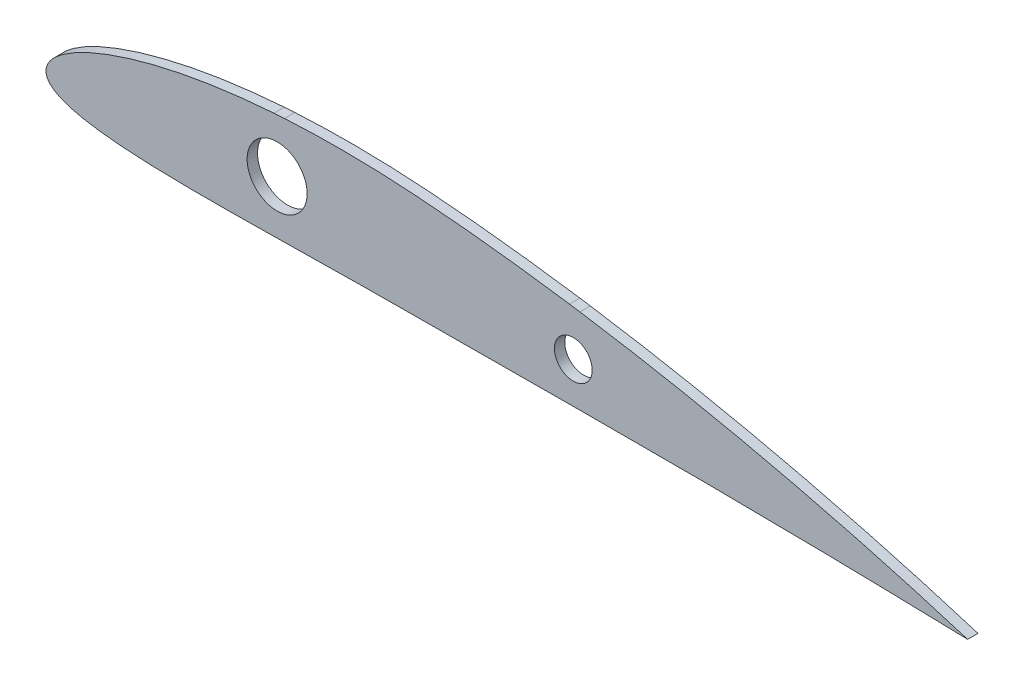
ISO-10303-21;
HEADER;
FILE_DESCRIPTION(('STEP AP214'),'2;1');
FILE_NAME('part.step','',(''),(''),'','','');
FILE_SCHEMA(('AUTOMOTIVE_DESIGN { 1 0 10303 214 1 1 1 1 }'));
ENDSEC;
DATA;
#1=APPLICATION_CONTEXT('core data for automotive mechanical design processes');
#2=APPLICATION_PROTOCOL_DEFINITION('international standard','automotive_design',2000,#1);
#3=PRODUCT_CONTEXT('',#1,'mechanical');
#4=PRODUCT('Part','Part','',(#3));
#5=PRODUCT_RELATED_PRODUCT_CATEGORY('part','',(#4));
#6=PRODUCT_DEFINITION_FORMATION('','',#4);
#7=PRODUCT_DEFINITION_CONTEXT('part definition',#1,'design');
#8=PRODUCT_DEFINITION('design','',#6,#7);
#9=PRODUCT_DEFINITION_SHAPE('','',#8);
#10=(LENGTH_UNIT() NAMED_UNIT(*) SI_UNIT(.MILLI.,.METRE.));
#11=(NAMED_UNIT(*) PLANE_ANGLE_UNIT() SI_UNIT($,.RADIAN.));
#12=(NAMED_UNIT(*) SI_UNIT($,.STERADIAN.) SOLID_ANGLE_UNIT());
#13=UNCERTAINTY_MEASURE_WITH_UNIT(LENGTH_MEASURE(1.E-05),#10,'distance_accuracy_value','');
#14=(GEOMETRIC_REPRESENTATION_CONTEXT(3) GLOBAL_UNCERTAINTY_ASSIGNED_CONTEXT((#13)) GLOBAL_UNIT_ASSIGNED_CONTEXT((#10,
#11,#12)) REPRESENTATION_CONTEXT('',''));
#15=CARTESIAN_POINT('',(0.,0.,0.));
#16=DIRECTION('',(0.,0.,1.));
#17=DIRECTION('',(1.,0.,0.));
#18=AXIS2_PLACEMENT_3D('',#15,#16,#17);
#19=CARTESIAN_POINT('',(149.894619256414,106.854755989877,1.4));
#20=CARTESIAN_POINT('',(158.680275082572,106.889957074756,1.4));
#21=CARTESIAN_POINT('',(176.251614136073,106.916321204518,1.4));
#22=CARTESIAN_POINT('',(202.609661936218,106.73064533298,1.4));
#23=CARTESIAN_POINT('',(228.96468105988,106.292568252224,1.4));
#24=CARTESIAN_POINT('',(246.530526636941,105.850587700062,1.4));
#25=CARTESIAN_POINT('',(255.312881654357,105.60676111473,1.4));
#26=B_SPLINE_CURVE_WITH_KNOTS('',3,(#19,#20,#21,#22,#23,#24,#25),.UNSPECIFIED.,.F.,.F.,(4,1,1,1,
4),(0.581490104405728,0.685469054372265,0.789448004338803,0.89342695430534,0.997405904271877),.UNSPECIFIED.);
#27=DIRECTION('',(0.,0.,-1.));
#28=VECTOR('',#27,1.);
#29=SURFACE_OF_LINEAR_EXTRUSION('',#26,#28);
#30=CARTESIAN_POINT('',(149.894619256414,106.854755989877,-1.4));
#31=CARTESIAN_POINT('',(158.680275082572,106.889957074756,-1.4));
#32=CARTESIAN_POINT('',(176.251614136073,106.916321204518,-1.4));
#33=CARTESIAN_POINT('',(202.609661936218,106.73064533298,-1.4));
#34=CARTESIAN_POINT('',(228.96468105988,106.292568252224,-1.4));
#35=CARTESIAN_POINT('',(246.530526636941,105.850587700062,-1.4));
#36=CARTESIAN_POINT('',(255.312881654357,105.60676111473,-1.4));
#37=B_SPLINE_CURVE_WITH_KNOTS('',3,(#30,#31,#32,#33,#34,#35,#36),.UNSPECIFIED.,.F.,.F.,(4,1,1,1,
4),(0.581490104405728,0.685469054372265,0.789448004338803,0.89342695430534,0.997405904271877),.UNSPECIFIED.);
#38=CARTESIAN_POINT('',(149.894619256414,106.854755989877,-1.4));
#39=VERTEX_POINT('',#38);
#40=CARTESIAN_POINT('',(255.312881654357,105.60676111473,-1.4));
#41=VERTEX_POINT('',#40);
#42=EDGE_CURVE('E264',#39,#41,#37,.T.);
#43=ORIENTED_EDGE('',*,*,#42,.T.);
#44=DIRECTION('',(0.,0.,-1.));
#45=VECTOR('',#44,1.);
#46=CARTESIAN_POINT('',(255.312881654357,105.60676111473,1.4));
#47=LINE('',#46,#45);
#48=CARTESIAN_POINT('',(255.312881654357,105.60676111473,1.4));
#49=VERTEX_POINT('',#48);
#50=EDGE_CURVE('E11',#49,#41,#47,.T.);
#51=ORIENTED_EDGE('',*,*,#50,.F.);
#52=CARTESIAN_POINT('',(149.894619256414,106.854755989877,1.4));
#53=VERTEX_POINT('',#52);
#54=EDGE_CURVE('E211',#53,#49,#26,.T.);
#55=ORIENTED_EDGE('',*,*,#54,.F.);
#56=DIRECTION('',(0.,0.,-1.));
#57=VECTOR('',#56,1.);
#58=CARTESIAN_POINT('',(149.894619256414,106.854755989877,1.4));
#59=LINE('',#58,#57);
#60=EDGE_CURVE('E142',#53,#39,#59,.T.);
#61=ORIENTED_EDGE('',*,*,#60,.T.);
#62=EDGE_LOOP('',(#43,#51,#55,#61));
#63=FACE_BOUND('',#62,.T.);
#64=ADVANCED_FACE('F37',(#63),#29,.F.);
#65=CARTESIAN_POINT('',(255.312881654358,105.60676111473,1.4));
#66=CARTESIAN_POINT('',(246.756257413018,108.260896884077,1.4));
#67=CARTESIAN_POINT('',(229.54444233678,113.256971155102,1.4));
#68=CARTESIAN_POINT('',(203.47024089322,119.799788090143,1.4));
#69=CARTESIAN_POINT('',(177.178570900204,125.40441699623,1.4));
#70=CARTESIAN_POINT('',(159.522198848407,128.478032217996,1.4));
#71=CARTESIAN_POINT('',(150.666396797955,129.829620390137,1.4));
#72=B_SPLINE_CURVE_WITH_KNOTS('',3,(#65,#66,#67,#68,#69,#70,#71),.UNSPECIFIED.,.F.,.F.,(4,1,1,1,
4),(0.00222757964376328,0.106325046268382,0.210422512893002,0.314519979517621,0.41861744614224),.UNSPECIFIED.);
#73=DIRECTION('',(0.,0.,-1.));
#74=VECTOR('',#73,1.);
#75=SURFACE_OF_LINEAR_EXTRUSION('',#72,#74);
#76=CARTESIAN_POINT('',(255.312881654358,105.60676111473,-1.4));
#77=CARTESIAN_POINT('',(246.756257413018,108.260896884077,-1.4));
#78=CARTESIAN_POINT('',(229.54444233678,113.256971155102,-1.4));
#79=CARTESIAN_POINT('',(203.47024089322,119.799788090143,-1.4));
#80=CARTESIAN_POINT('',(177.178570900204,125.40441699623,-1.4));
#81=CARTESIAN_POINT('',(159.522198848407,128.478032217996,-1.4));
#82=CARTESIAN_POINT('',(150.666396797955,129.829620390137,-1.4));
#83=B_SPLINE_CURVE_WITH_KNOTS('',3,(#76,#77,#78,#79,#80,#81,#82),.UNSPECIFIED.,.F.,.F.,(4,1,1,1,
4),(0.00222757964376328,0.106325046268382,0.210422512893002,0.314519979517621,0.41861744614224),.UNSPECIFIED.);
#84=CARTESIAN_POINT('',(150.666396797955,129.829620390137,-1.4));
#85=VERTEX_POINT('',#84);
#86=EDGE_CURVE('E258',#41,#85,#83,.T.);
#87=ORIENTED_EDGE('',*,*,#86,.T.);
#88=DIRECTION('',(0.,0.,-1.));
#89=VECTOR('',#88,1.);
#90=CARTESIAN_POINT('',(150.666396797955,129.829620390137,1.4));
#91=LINE('',#90,#89);
#92=CARTESIAN_POINT('',(150.666396797955,129.829620390137,1.4));
#93=VERTEX_POINT('',#92);
#94=EDGE_CURVE('E46',#93,#85,#91,.T.);
#95=ORIENTED_EDGE('',*,*,#94,.F.);
#96=EDGE_CURVE('E103',#49,#93,#72,.T.);
#97=ORIENTED_EDGE('',*,*,#96,.F.);
#98=ORIENTED_EDGE('',*,*,#50,.T.);
#99=EDGE_LOOP('',(#87,#95,#97,#98));
#100=FACE_BOUND('',#99,.T.);
#101=ADVANCED_FACE('F203',(#100),#75,.F.);
#102=CARTESIAN_POINT('',(22.4132301607229,149.108042258837,1.4));
#103=DIRECTION('',(-0.14864544722991,-0.988890555631825,0.));
#104=DIRECTION('',(0.988890555631825,-0.14864544722991,0.));
#105=AXIS2_PLACEMENT_3D('',#102,#103,#104);
#106=PLANE('',#105);
#107=DIRECTION('',(-0.988890555631825,0.14864544722991,0.));
#108=VECTOR('',#107,1.);
#109=CARTESIAN_POINT('',(22.4132301607229,149.108042258837,-1.4));
#110=LINE('',#109,#108);
#111=CARTESIAN_POINT('',(147.830444308953,130.25590763057,-1.4));
#112=VERTEX_POINT('',#111);
#113=EDGE_CURVE('E253',#85,#112,#110,.T.);
#114=ORIENTED_EDGE('',*,*,#113,.T.);
#115=DIRECTION('',(0.,0.,-1.));
#116=VECTOR('',#115,1.);
#117=CARTESIAN_POINT('',(147.830444308953,130.25590763057,1.4));
#118=LINE('',#117,#116);
#119=CARTESIAN_POINT('',(147.830444308953,130.25590763057,1.4));
#120=VERTEX_POINT('',#119);
#121=EDGE_CURVE('E247',#120,#112,#118,.T.);
#122=ORIENTED_EDGE('',*,*,#121,.F.);
#123=DIRECTION('',(-0.988890555631825,0.14864544722991,0.));
#124=VECTOR('',#123,1.);
#125=CARTESIAN_POINT('',(22.4132301607229,149.108042258837,1.4));
#126=LINE('',#125,#124);
#127=EDGE_CURVE('E189',#93,#120,#126,.T.);
#128=ORIENTED_EDGE('',*,*,#127,.F.);
#129=ORIENTED_EDGE('',*,*,#94,.T.);
#130=EDGE_LOOP('',(#114,#122,#128,#129));
#131=FACE_BOUND('',#130,.T.);
#132=ADVANCED_FACE('F199',(#131),#106,.F.);
#133=CARTESIAN_POINT('',(147.830444308953,130.25590763057,1.4));
#134=CARTESIAN_POINT('',(141.461413304036,131.198524365851,1.4));
#135=CARTESIAN_POINT('',(128.693359955321,132.886388705285,1.4));
#136=CARTESIAN_POINT('',(112.670431319567,134.46164524872,1.4));
#137=CARTESIAN_POINT('',(99.8269687406522,135.315000174992,1.4));
#138=CARTESIAN_POINT('',(86.9640203559628,135.731264376099,1.4));
#139=CARTESIAN_POINT('',(77.3083419090292,135.549477481379,1.4));
#140=CARTESIAN_POINT('',(70.8877326550715,135.171040435875,1.4));
#141=B_SPLINE_CURVE_WITH_KNOTS('',3,(#133,#134,#135,#136,#137,#138,#139,#140),.UNSPECIFIED.,.F.,
.F.,(4,1,1,1,1,4),(0.429725304294191,0.50454493038584,0.57936455647749,0.616774369523314,
0.654184182569139,0.729003808660788),.UNSPECIFIED.);
#142=DIRECTION('',(0.,0.,-1.));
#143=VECTOR('',#142,1.);
#144=SURFACE_OF_LINEAR_EXTRUSION('',#141,#143);
#145=CARTESIAN_POINT('',(147.830444308953,130.25590763057,-1.4));
#146=CARTESIAN_POINT('',(141.461413304036,131.198524365851,-1.4));
#147=CARTESIAN_POINT('',(128.693359955321,132.886388705285,-1.4));
#148=CARTESIAN_POINT('',(112.670431319567,134.46164524872,-1.4));
#149=CARTESIAN_POINT('',(99.8269687406522,135.315000174992,-1.4));
#150=CARTESIAN_POINT('',(86.9640203559628,135.731264376099,-1.4));
#151=CARTESIAN_POINT('',(77.3083419090292,135.549477481379,-1.4));
#152=CARTESIAN_POINT('',(70.8877326550715,135.171040435875,-1.4));
#153=B_SPLINE_CURVE_WITH_KNOTS('',3,(#145,#146,#147,#148,#149,#150,#151,#152),.UNSPECIFIED.,.F.,
.F.,(4,1,1,1,1,4),(0.429725304294191,0.50454493038584,0.57936455647749,0.616774369523314,
0.654184182569139,0.729003808660788),.UNSPECIFIED.);
#154=CARTESIAN_POINT('',(70.8877326550715,135.171040435875,-1.4));
#155=VERTEX_POINT('',#154);
#156=EDGE_CURVE('E260',#112,#155,#153,.T.);
#157=ORIENTED_EDGE('',*,*,#156,.T.);
#158=DIRECTION('',(0.,0.,-1.));
#159=VECTOR('',#158,1.);
#160=CARTESIAN_POINT('',(70.8877326550715,135.171040435875,1.4));
#161=LINE('',#160,#159);
#162=CARTESIAN_POINT('',(70.8877326550715,135.171040435875,1.4));
#163=VERTEX_POINT('',#162);
#164=EDGE_CURVE('E244',#163,#155,#161,.T.);
#165=ORIENTED_EDGE('',*,*,#164,.F.);
#166=EDGE_CURVE('E184',#120,#163,#141,.T.);
#167=ORIENTED_EDGE('',*,*,#166,.F.);
#168=ORIENTED_EDGE('',*,*,#121,.T.);
#169=EDGE_LOOP('',(#157,#165,#167,#168));
#170=FACE_BOUND('',#169,.T.);
#171=ADVANCED_FACE('F195',(#170),#144,.F.);
#172=CARTESIAN_POINT('',(-8.44678797017762,130.016927928256,1.4));
#173=DIRECTION('',(0.06483016250442,-0.99789631226378,0.));
#174=DIRECTION('',(0.99789631226378,0.06483016250442,0.));
#175=AXIS2_PLACEMENT_3D('',#172,#173,#174);
#176=PLANE('',#175);
#177=DIRECTION('',(-0.99789631226378,-0.06483016250442,0.));
#178=VECTOR('',#177,1.);
#179=CARTESIAN_POINT('',(-8.44678797017762,130.016927928256,-1.4));
#180=LINE('',#179,#178);
#181=CARTESIAN_POINT('',(68.0343243508861,134.985663536714,-1.4));
#182=VERTEX_POINT('',#181);
#183=EDGE_CURVE('E262',#155,#182,#180,.T.);
#184=ORIENTED_EDGE('',*,*,#183,.T.);
#185=DIRECTION('',(0.,0.,-1.));
#186=VECTOR('',#185,1.);
#187=CARTESIAN_POINT('',(68.0343243508861,134.985663536714,1.4));
#188=LINE('',#187,#186);
#189=CARTESIAN_POINT('',(68.0343243508861,134.985663536714,1.4));
#190=VERTEX_POINT('',#189);
#191=EDGE_CURVE('E241',#190,#182,#188,.T.);
#192=ORIENTED_EDGE('',*,*,#191,.F.);
#193=DIRECTION('',(-0.99789631226378,-0.06483016250442,0.));
#194=VECTOR('',#193,1.);
#195=CARTESIAN_POINT('',(-8.44678797017762,130.016927928256,1.4));
#196=LINE('',#195,#194);
#197=EDGE_CURVE('E179',#163,#190,#196,.T.);
#198=ORIENTED_EDGE('',*,*,#197,.F.);
#199=ORIENTED_EDGE('',*,*,#164,.T.);
#200=EDGE_LOOP('',(#184,#192,#198,#199));
#201=FACE_BOUND('',#200,.T.);
#202=ADVANCED_FACE('F198',(#201),#176,.F.);
#203=CARTESIAN_POINT('',(68.0343243508861,134.985663536714,1.4));
#204=CARTESIAN_POINT('',(62.4663272915128,134.590052618776,1.4));
#205=CARTESIAN_POINT('',(54.1287667732198,133.700155230356,1.4));
#206=CARTESIAN_POINT('',(43.125220572952,131.802909903816,1.4));
#207=CARTESIAN_POINT('',(34.9537761482906,129.977054103772,1.4));
#208=CARTESIAN_POINT('',(26.9071914758097,127.675989274361,1.4));
#209=CARTESIAN_POINT('',(20.3679809041667,125.262128548987,1.4));
#210=CARTESIAN_POINT('',(15.3365499347751,122.888373262699,1.4));
#211=CARTESIAN_POINT('',(11.7395607910426,120.808049658938,1.4));
#212=CARTESIAN_POINT('',(8.99153245879158,118.69641057424,1.4));
#213=CARTESIAN_POINT('',(7.48174934294299,116.88622792471,1.4));
#214=CARTESIAN_POINT('',(6.915411804354,115.858161553268,1.4));
#215=CARTESIAN_POINT('',(6.7078970409493,115.274334725607,1.4));
#216=CARTESIAN_POINT('',(6.62545754213481,114.936901914895,1.4));
#217=CARTESIAN_POINT('',(6.58542850054553,114.772902260157,1.4));
#218=B_SPLINE_CURVE_WITH_KNOTS('',3,(#203,#204,#205,#206,#207,#208,#209,#210,#211,#212,#213,
#214,#215,#216,#217),.UNSPECIFIED.,.F.,.F.,(4,1,1,1,1,1,1,1,1,1,1,1,4),(0.740090669371658,
0.805048089327921,0.837526799306053,0.870005509284185,0.902484219262317,0.934962929240448,
0.951202284229514,0.96744163921858,0.983680994207646,0.991800671702179,0.995860510449445,
0.997890429823078,0.999920349196711),.UNSPECIFIED.);
#219=DIRECTION('',(0.,0.,-1.));
#220=VECTOR('',#219,1.);
#221=SURFACE_OF_LINEAR_EXTRUSION('',#218,#220);
#222=CARTESIAN_POINT('',(68.0343243508861,134.985663536714,-1.4));
#223=CARTESIAN_POINT('',(62.4663272915128,134.590052618776,-1.4));
#224=CARTESIAN_POINT('',(54.1287667732198,133.700155230356,-1.4));
#225=CARTESIAN_POINT('',(43.125220572952,131.802909903816,-1.4));
#226=CARTESIAN_POINT('',(34.9537761482906,129.977054103772,-1.4));
#227=CARTESIAN_POINT('',(26.9071914758097,127.675989274361,-1.4));
#228=CARTESIAN_POINT('',(20.3679809041667,125.262128548987,-1.4));
#229=CARTESIAN_POINT('',(15.3365499347751,122.888373262699,-1.4));
#230=CARTESIAN_POINT('',(11.7395607910426,120.808049658938,-1.4));
#231=CARTESIAN_POINT('',(8.99153245879158,118.69641057424,-1.4));
#232=CARTESIAN_POINT('',(7.48174934294299,116.88622792471,-1.4));
#233=CARTESIAN_POINT('',(6.915411804354,115.858161553268,-1.4));
#234=CARTESIAN_POINT('',(6.7078970409493,115.274334725607,-1.4));
#235=CARTESIAN_POINT('',(6.62545754213481,114.936901914895,-1.4));
#236=CARTESIAN_POINT('',(6.58542850054553,114.772902260157,-1.4));
#237=B_SPLINE_CURVE_WITH_KNOTS('',3,(#222,#223,#224,#225,#226,#227,#228,#229,#230,#231,#232,
#233,#234,#235,#236),.UNSPECIFIED.,.F.,.F.,(4,1,1,1,1,1,1,1,1,1,1,1,4),(0.740090669371658,
0.805048089327921,0.837526799306053,0.870005509284185,0.902484219262317,0.934962929240448,
0.951202284229514,0.96744163921858,0.983680994207646,0.991800671702179,0.995860510449445,
0.997890429823078,0.999920349196711),.UNSPECIFIED.);
#238=CARTESIAN_POINT('',(6.58542850054553,114.772902260157,-1.4));
#239=VERTEX_POINT('',#238);
#240=EDGE_CURVE('E276',#182,#239,#237,.T.);
#241=ORIENTED_EDGE('',*,*,#240,.T.);
#242=DIRECTION('',(0.,0.,-1.));
#243=VECTOR('',#242,1.);
#244=CARTESIAN_POINT('',(6.58542850054553,114.772902260157,1.4));
#245=LINE('',#244,#243);
#246=CARTESIAN_POINT('',(6.58542850054553,114.772902260157,1.4));
#247=VERTEX_POINT('',#246);
#248=EDGE_CURVE('E238',#247,#239,#245,.T.);
#249=ORIENTED_EDGE('',*,*,#248,.F.);
#250=EDGE_CURVE('E171',#190,#247,#218,.T.);
#251=ORIENTED_EDGE('',*,*,#250,.F.);
#252=ORIENTED_EDGE('',*,*,#191,.T.);
#253=EDGE_LOOP('',(#241,#249,#251,#252));
#254=FACE_BOUND('',#253,.T.);
#255=ADVANCED_FACE('F164',(#254),#221,.F.);
#256=CARTESIAN_POINT('',(6.58542850054553,114.772902260157,1.4));
#257=CARTESIAN_POINT('',(6.56366414620477,114.614273347557,1.4));
#258=CARTESIAN_POINT('',(6.5190093469714,114.285406452402,1.4));
#259=CARTESIAN_POINT('',(6.51479072954578,113.710879009962,1.4));
#260=CARTESIAN_POINT('',(6.74189878291116,112.661535218991,1.4));
#261=CARTESIAN_POINT('',(7.66018429255603,111.409854012936,1.4));
#262=CARTESIAN_POINT('',(9.25908473021288,110.308268876171,1.4));
#263=CARTESIAN_POINT('',(11.044608156902,109.487380203342,1.4));
#264=CARTESIAN_POINT('',(12.9221944408203,108.850067693768,1.4));
#265=CARTESIAN_POINT('',(15.4901264572917,108.172753601497,1.4));
#266=CARTESIAN_POINT('',(18.7685029621804,107.558568006788,1.4));
#267=CARTESIAN_POINT('',(22.7454433758667,107.043168293996,1.4));
#268=CARTESIAN_POINT('',(28.0773130031014,106.557350361525,1.4));
#269=CARTESIAN_POINT('',(34.769590400056,106.213470374942,1.4));
#270=CARTESIAN_POINT('',(42.813490810935,106.037235573254,1.4));
#271=CARTESIAN_POINT('',(50.8626774800394,106.006056339145,1.4));
#272=CARTESIAN_POINT('',(58.9136155720875,106.062256394151,1.4));
#273=CARTESIAN_POINT('',(64.2820421930946,106.132538160557,1.4));
#274=CARTESIAN_POINT('',(66.9660117195889,106.171159396513,1.4));
#275=B_SPLINE_CURVE_WITH_KNOTS('',3,(#256,#257,#258,#259,#260,#261,#262,#263,#264,#265,#266,
#267,#268,#269,#270,#271,#272,#273,#274),.UNSPECIFIED.,.F.,.F.,(4,1,1,1,1,1,1,1,1,1,1,1,1,1,1,1,
4),(8.11675194704331E-05,0.00206730045466935,0.00405343338986826,0.00802569926026608,
0.0159702310010617,0.0239147627418574,0.031859294482653,0.0398038262234487,0.0477483579642443,
0.0636374214458356,0.0795264849274269,0.0954155484090183,0.127193675372201,0.158971802335383,
0.190749929298566,0.222528056261749,0.254306183224931),.UNSPECIFIED.);
#276=DIRECTION('',(0.,0.,-1.));
#277=VECTOR('',#276,1.);
#278=SURFACE_OF_LINEAR_EXTRUSION('',#275,#277);
#279=CARTESIAN_POINT('',(6.58542850054553,114.772902260157,-1.4));
#280=CARTESIAN_POINT('',(6.56366414620477,114.614273347557,-1.4));
#281=CARTESIAN_POINT('',(6.5190093469714,114.285406452402,-1.4));
#282=CARTESIAN_POINT('',(6.51479072954578,113.710879009962,-1.4));
#283=CARTESIAN_POINT('',(6.74189878291116,112.661535218991,-1.4));
#284=CARTESIAN_POINT('',(7.66018429255603,111.409854012936,-1.4));
#285=CARTESIAN_POINT('',(9.25908473021288,110.308268876171,-1.4));
#286=CARTESIAN_POINT('',(11.044608156902,109.487380203342,-1.4));
#287=CARTESIAN_POINT('',(12.9221944408203,108.850067693768,-1.4));
#288=CARTESIAN_POINT('',(15.4901264572917,108.172753601497,-1.4));
#289=CARTESIAN_POINT('',(18.7685029621804,107.558568006788,-1.4));
#290=CARTESIAN_POINT('',(22.7454433758667,107.043168293996,-1.4));
#291=CARTESIAN_POINT('',(28.0773130031014,106.557350361525,-1.4));
#292=CARTESIAN_POINT('',(34.769590400056,106.213470374942,-1.4));
#293=CARTESIAN_POINT('',(42.813490810935,106.037235573254,-1.4));
#294=CARTESIAN_POINT('',(50.8626774800394,106.006056339145,-1.4));
#295=CARTESIAN_POINT('',(58.9136155720875,106.062256394151,-1.4));
#296=CARTESIAN_POINT('',(64.2820421930946,106.132538160557,-1.4));
#297=CARTESIAN_POINT('',(66.9660117195889,106.171159396513,-1.4));
#298=B_SPLINE_CURVE_WITH_KNOTS('',3,(#279,#280,#281,#282,#283,#284,#285,#286,#287,#288,#289,
#290,#291,#292,#293,#294,#295,#296,#297),.UNSPECIFIED.,.F.,.F.,(4,1,1,1,1,1,1,1,1,1,1,1,1,1,1,1,
4),(8.11675194704331E-05,0.00206730045466935,0.00405343338986826,0.00802569926026608,
0.0159702310010617,0.0239147627418574,0.031859294482653,0.0398038262234487,0.0477483579642443,
0.0636374214458356,0.0795264849274269,0.0954155484090183,0.127193675372201,0.158971802335383,
0.190749929298566,0.222528056261749,0.254306183224931),.UNSPECIFIED.);
#299=CARTESIAN_POINT('',(66.9660117195889,106.171159396513,-1.4));
#300=VERTEX_POINT('',#299);
#301=EDGE_CURVE('E280',#239,#300,#298,.T.);
#302=ORIENTED_EDGE('',*,*,#301,.T.);
#303=DIRECTION('',(0.,0.,-1.));
#304=VECTOR('',#303,1.);
#305=CARTESIAN_POINT('',(66.9660117195889,106.171159396513,1.4));
#306=LINE('',#305,#304);
#307=CARTESIAN_POINT('',(66.9660117195889,106.171159396513,1.4));
#308=VERTEX_POINT('',#307);
#309=EDGE_CURVE('E137',#308,#300,#306,.T.);
#310=ORIENTED_EDGE('',*,*,#309,.F.);
#311=EDGE_CURVE('E128',#247,#308,#275,.T.);
#312=ORIENTED_EDGE('',*,*,#311,.F.);
#313=ORIENTED_EDGE('',*,*,#248,.T.);
#314=EDGE_LOOP('',(#302,#310,#312,#313));
#315=FACE_BOUND('',#314,.T.);
#316=ADVANCED_FACE('F161',(#315),#278,.F.);
#317=CARTESIAN_POINT('',(-1.55725848249838,105.156400011837,1.4));
#318=DIRECTION('',(-0.0148073512648334,0.999890365164361,0.));
#319=DIRECTION('',(-0.999890365164361,-0.0148073512648334,0.));
#320=AXIS2_PLACEMENT_3D('',#317,#318,#319);
#321=PLANE('',#320);
#322=DIRECTION('',(0.999890365164361,0.0148073512648334,0.));
#323=VECTOR('',#322,1.);
#324=CARTESIAN_POINT('',(-1.55725848249838,105.156400011837,-1.4));
#325=LINE('',#324,#323);
#326=CARTESIAN_POINT('',(69.8190690071352,106.213410250114,-1.4));
#327=VERTEX_POINT('',#326);
#328=EDGE_CURVE('E136',#300,#327,#325,.T.);
#329=ORIENTED_EDGE('',*,*,#328,.T.);
#330=DIRECTION('',(0.,0.,-1.));
#331=VECTOR('',#330,1.);
#332=CARTESIAN_POINT('',(69.8190690071352,106.213410250114,1.4));
#333=LINE('',#332,#331);
#334=CARTESIAN_POINT('',(69.8190690071352,106.213410250114,1.4));
#335=VERTEX_POINT('',#334);
#336=EDGE_CURVE('E133',#335,#327,#333,.T.);
#337=ORIENTED_EDGE('',*,*,#336,.F.);
#338=DIRECTION('',(0.999890365164361,0.0148073512648334,0.));
#339=VECTOR('',#338,1.);
#340=CARTESIAN_POINT('',(-1.55725848249838,105.156400011837,1.4));
#341=LINE('',#340,#339);
#342=EDGE_CURVE('E122',#308,#335,#341,.T.);
#343=ORIENTED_EDGE('',*,*,#342,.F.);
#344=ORIENTED_EDGE('',*,*,#309,.T.);
#345=EDGE_LOOP('',(#329,#337,#343,#344));
#346=FACE_BOUND('',#345,.T.);
#347=ADVANCED_FACE('F134',(#346),#321,.F.);
#348=CARTESIAN_POINT('',(69.8190690071352,106.213410250114,1.4));
#349=CARTESIAN_POINT('',(76.2538567327048,106.31100684137,1.4));
#350=CARTESIAN_POINT('',(85.9047948489214,106.47213737338,1.4));
#351=CARTESIAN_POINT('',(98.7779456737836,106.610759511662,1.4));
#352=CARTESIAN_POINT('',(111.651100899515,106.649514986469,1.4));
#353=CARTESIAN_POINT('',(127.735402572152,106.732475133212,1.4));
#354=CARTESIAN_POINT('',(140.606952956768,106.813706415112,1.4));
#355=CARTESIAN_POINT('',(147.042263767006,106.842620089855,1.4));
#356=B_SPLINE_CURVE_WITH_KNOTS('',3,(#348,#349,#350,#351,#352,#353,#354,#355),.UNSPECIFIED.,.F.,
.F.,(4,1,1,1,1,4),(0.265565078046195,0.341733084566208,0.379817087826214,0.41790109108622,
0.494069097606233,0.570237104126246),.UNSPECIFIED.);
#357=DIRECTION('',(0.,0.,-1.));
#358=VECTOR('',#357,1.);
#359=SURFACE_OF_LINEAR_EXTRUSION('',#356,#358);
#360=CARTESIAN_POINT('',(69.8190690071352,106.213410250114,-1.4));
#361=CARTESIAN_POINT('',(76.2538567327048,106.31100684137,-1.4));
#362=CARTESIAN_POINT('',(85.9047948489214,106.47213737338,-1.4));
#363=CARTESIAN_POINT('',(98.7779456737836,106.610759511662,-1.4));
#364=CARTESIAN_POINT('',(111.651100899515,106.649514986469,-1.4));
#365=CARTESIAN_POINT('',(127.735402572152,106.732475133212,-1.4));
#366=CARTESIAN_POINT('',(140.606952956768,106.813706415112,-1.4));
#367=CARTESIAN_POINT('',(147.042263767006,106.842620089855,-1.4));
#368=B_SPLINE_CURVE_WITH_KNOTS('',3,(#360,#361,#362,#363,#364,#365,#366,#367),.UNSPECIFIED.,.F.,
.F.,(4,1,1,1,1,4),(0.265565078046195,0.341733084566208,0.379817087826214,0.41790109108622,
0.494069097606233,0.570237104126246),.UNSPECIFIED.);
#369=CARTESIAN_POINT('',(147.042263767006,106.842620089855,-1.4));
#370=VERTEX_POINT('',#369);
#371=EDGE_CURVE('E89',#327,#370,#368,.T.);
#372=ORIENTED_EDGE('',*,*,#371,.T.);
#373=DIRECTION('',(0.,0.,-1.));
#374=VECTOR('',#373,1.);
#375=CARTESIAN_POINT('',(147.042263767006,106.842620089855,1.4));
#376=LINE('',#375,#374);
#377=CARTESIAN_POINT('',(147.042263767006,106.842620089855,1.4));
#378=VERTEX_POINT('',#377);
#379=EDGE_CURVE('E138',#378,#370,#376,.T.);
#380=ORIENTED_EDGE('',*,*,#379,.F.);
#381=EDGE_CURVE('E126',#335,#378,#356,.T.);
#382=ORIENTED_EDGE('',*,*,#381,.F.);
#383=ORIENTED_EDGE('',*,*,#336,.T.);
#384=EDGE_LOOP('',(#372,#380,#382,#383));
#385=FACE_BOUND('',#384,.T.);
#386=ADVANCED_FACE('F140',(#385),#359,.F.);
#387=CARTESIAN_POINT('',(68.9168426026147,120.636945020621,1.4));
#388=DIRECTION('',(0.,0.,-1.));
#389=DIRECTION('',(-1.,0.,0.));
#390=AXIS2_PLACEMENT_3D('',#387,#388,#389);
#391=CYLINDRICAL_SURFACE('',#390,8.10000000000001);
#392=CARTESIAN_POINT('',(68.9168426026147,120.636945020621,1.4));
#393=DIRECTION('',(0.,0.,1.));
#394=DIRECTION('',(1.,0.,0.));
#395=AXIS2_PLACEMENT_3D('',#392,#393,#394);
#396=CIRCLE('',#395,8.10000000000001);
#397=CARTESIAN_POINT('',(77.0168426026147,120.636945020621,1.4));
#398=VERTEX_POINT('',#397);
#399=EDGE_CURVE('E219',#398,#398,#396,.T.);
#400=ORIENTED_EDGE('',*,*,#399,.T.);
#401=EDGE_LOOP('',(#400));
#402=FACE_BOUND('',#401,.T.);
#403=CARTESIAN_POINT('',(68.9168426026147,120.636945020621,-1.4));
#404=DIRECTION('',(0.,0.,1.));
#405=DIRECTION('',(1.,0.,0.));
#406=AXIS2_PLACEMENT_3D('',#403,#404,#405);
#407=CIRCLE('',#406,8.10000000000001);
#408=CARTESIAN_POINT('',(77.0168426026147,120.636945020621,-1.4));
#409=VERTEX_POINT('',#408);
#410=EDGE_CURVE('E295',#409,#409,#407,.T.);
#411=ORIENTED_EDGE('',*,*,#410,.F.);
#412=EDGE_LOOP('',(#411));
#413=FACE_BOUND('',#412,.T.);
#414=ADVANCED_FACE('F156',(#402,#413),#391,.F.);
#415=CARTESIAN_POINT('',(148.868108764142,117.844985284419,1.4));
#416=DIRECTION('',(0.,0.,-1.));
#417=DIRECTION('',(-1.,0.,0.));
#418=AXIS2_PLACEMENT_3D('',#415,#416,#417);
#419=CYLINDRICAL_SURFACE('',#418,5.09999999999998);
#420=CARTESIAN_POINT('',(148.868108764142,117.844985284419,1.4));
#421=DIRECTION('',(0.,0.,1.));
#422=DIRECTION('',(1.,0.,0.));
#423=AXIS2_PLACEMENT_3D('',#420,#421,#422);
#424=CIRCLE('',#423,5.09999999999998);
#425=CARTESIAN_POINT('',(153.968108764142,117.844985284419,1.4));
#426=VERTEX_POINT('',#425);
#427=EDGE_CURVE('E225',#426,#426,#424,.T.);
#428=ORIENTED_EDGE('',*,*,#427,.T.);
#429=EDGE_LOOP('',(#428));
#430=FACE_BOUND('',#429,.T.);
#431=CARTESIAN_POINT('',(148.868108764142,117.844985284419,-1.4));
#432=DIRECTION('',(0.,0.,1.));
#433=DIRECTION('',(1.,0.,0.));
#434=AXIS2_PLACEMENT_3D('',#431,#432,#433);
#435=CIRCLE('',#434,5.09999999999998);
#436=CARTESIAN_POINT('',(153.968108764142,117.844985284419,-1.4));
#437=VERTEX_POINT('',#436);
#438=EDGE_CURVE('E297',#437,#437,#435,.T.);
#439=ORIENTED_EDGE('',*,*,#438,.F.);
#440=EDGE_LOOP('',(#439));
#441=FACE_BOUND('',#440,.T.);
#442=ADVANCED_FACE('F39',(#430,#441),#419,.F.);
#443=CARTESIAN_POINT('',(-0.451912661683315,106.215077490182,1.4));
#444=DIRECTION('',(-0.00425465557301717,0.999990948912016,0.));
#445=DIRECTION('',(-0.999990948912016,-0.00425465557301717,0.));
#446=AXIS2_PLACEMENT_3D('',#443,#444,#445);
#447=PLANE('',#446);
#448=DIRECTION('',(0.999990948912017,0.00425465557301717,0.));
#449=VECTOR('',#448,1.);
#450=CARTESIAN_POINT('',(-0.451912661683315,106.215077490182,-1.4));
#451=LINE('',#450,#449);
#452=EDGE_CURVE('E95',#370,#39,#451,.T.);
#453=ORIENTED_EDGE('',*,*,#452,.T.);
#454=ORIENTED_EDGE('',*,*,#60,.F.);
#455=DIRECTION('',(0.999990948912017,0.00425465557301717,0.));
#456=VECTOR('',#455,1.);
#457=CARTESIAN_POINT('',(-0.451912661683315,106.215077490182,1.4));
#458=LINE('',#457,#456);
#459=EDGE_CURVE('E54',#378,#53,#458,.T.);
#460=ORIENTED_EDGE('',*,*,#459,.F.);
#461=ORIENTED_EDGE('',*,*,#379,.T.);
#462=EDGE_LOOP('',(#453,#454,#460,#461));
#463=FACE_BOUND('',#462,.T.);
#464=ADVANCED_FACE('F157',(#463),#447,.F.);
#465=CARTESIAN_POINT('',(0.,0.,1.4));
#466=DIRECTION('',(0.,0.,1.));
#467=DIRECTION('',(1.,0.,0.));
#468=AXIS2_PLACEMENT_3D('',#465,#466,#467);
#469=PLANE('',#468);
#470=ORIENTED_EDGE('',*,*,#427,.F.);
#471=EDGE_LOOP('',(#470));
#472=FACE_BOUND('',#471,.T.);
#473=ORIENTED_EDGE('',*,*,#399,.F.);
#474=EDGE_LOOP('',(#473));
#475=FACE_BOUND('',#474,.T.);
#476=ORIENTED_EDGE('',*,*,#54,.T.);
#477=ORIENTED_EDGE('',*,*,#96,.T.);
#478=ORIENTED_EDGE('',*,*,#127,.T.);
#479=ORIENTED_EDGE('',*,*,#166,.T.);
#480=ORIENTED_EDGE('',*,*,#197,.T.);
#481=ORIENTED_EDGE('',*,*,#250,.T.);
#482=ORIENTED_EDGE('',*,*,#311,.T.);
#483=ORIENTED_EDGE('',*,*,#342,.T.);
#484=ORIENTED_EDGE('',*,*,#381,.T.);
#485=ORIENTED_EDGE('',*,*,#459,.T.);
#486=EDGE_LOOP('',(#476,#477,#478,#479,#480,#481,#482,#483,#484,#485));
#487=FACE_BOUND('',#486,.T.);
#488=ADVANCED_FACE('F124',(#472,#475,#487),#469,.T.);
#489=CARTESIAN_POINT('',(0.,0.,-1.4));
#490=DIRECTION('',(0.,0.,1.));
#491=DIRECTION('',(1.,0.,0.));
#492=AXIS2_PLACEMENT_3D('',#489,#490,#491);
#493=PLANE('',#492);
#494=ORIENTED_EDGE('',*,*,#438,.T.);
#495=EDGE_LOOP('',(#494));
#496=FACE_BOUND('',#495,.T.);
#497=ORIENTED_EDGE('',*,*,#410,.T.);
#498=EDGE_LOOP('',(#497));
#499=FACE_BOUND('',#498,.T.);
#500=ORIENTED_EDGE('',*,*,#42,.F.);
#501=ORIENTED_EDGE('',*,*,#452,.F.);
#502=ORIENTED_EDGE('',*,*,#371,.F.);
#503=ORIENTED_EDGE('',*,*,#328,.F.);
#504=ORIENTED_EDGE('',*,*,#301,.F.);
#505=ORIENTED_EDGE('',*,*,#240,.F.);
#506=ORIENTED_EDGE('',*,*,#183,.F.);
#507=ORIENTED_EDGE('',*,*,#156,.F.);
#508=ORIENTED_EDGE('',*,*,#113,.F.);
#509=ORIENTED_EDGE('',*,*,#86,.F.);
#510=EDGE_LOOP('',(#500,#501,#502,#503,#504,#505,#506,#507,#508,#509));
#511=FACE_BOUND('',#510,.T.);
#512=ADVANCED_FACE('F257',(#496,#499,#511),#493,.F.);
#513=CLOSED_SHELL('',(#64,#101,#132,#171,#202,#255,#316,#347,#386,#414,#442,#464,#488,#512));
#514=MANIFOLD_SOLID_BREP('B2',#513);
#515=ADVANCED_BREP_SHAPE_REPRESENTATION('',(#18,#514),#14);
#516=SHAPE_DEFINITION_REPRESENTATION(#9,#515);
ENDSEC;
END-ISO-10303-21;
